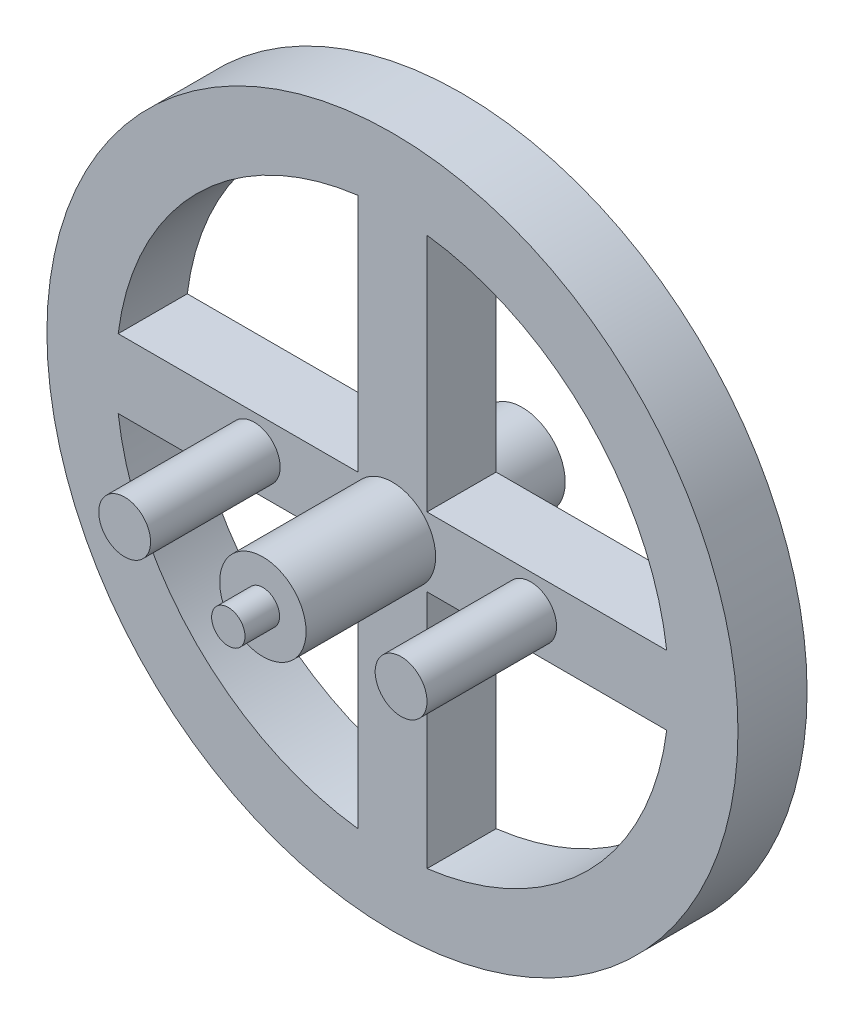
ISO-10303-21;
HEADER;
FILE_DESCRIPTION(('STEP AP214'),'2;1');
FILE_NAME('part.step','',(''),(''),'','','');
FILE_SCHEMA(('AUTOMOTIVE_DESIGN { 1 0 10303 214 1 1 1 1 }'));
ENDSEC;
DATA;
#1=APPLICATION_CONTEXT('core data for automotive mechanical design processes');
#2=APPLICATION_PROTOCOL_DEFINITION('international standard','automotive_design',2000,#1);
#3=PRODUCT_CONTEXT('',#1,'mechanical');
#4=PRODUCT('Part','Part','',(#3));
#5=PRODUCT_RELATED_PRODUCT_CATEGORY('part','',(#4));
#6=PRODUCT_DEFINITION_FORMATION('','',#4);
#7=PRODUCT_DEFINITION_CONTEXT('part definition',#1,'design');
#8=PRODUCT_DEFINITION('design','',#6,#7);
#9=PRODUCT_DEFINITION_SHAPE('','',#8);
#10=(LENGTH_UNIT() NAMED_UNIT(*) SI_UNIT(.MILLI.,.METRE.));
#11=(NAMED_UNIT(*) PLANE_ANGLE_UNIT() SI_UNIT($,.RADIAN.));
#12=(NAMED_UNIT(*) SI_UNIT($,.STERADIAN.) SOLID_ANGLE_UNIT());
#13=UNCERTAINTY_MEASURE_WITH_UNIT(LENGTH_MEASURE(1.E-05),#10,'distance_accuracy_value','');
#14=(GEOMETRIC_REPRESENTATION_CONTEXT(3) GLOBAL_UNCERTAINTY_ASSIGNED_CONTEXT((#13)) GLOBAL_UNIT_ASSIGNED_CONTEXT((#10,
#11,#12)) REPRESENTATION_CONTEXT('',''));
#15=CARTESIAN_POINT('',(0.,0.,0.));
#16=DIRECTION('',(0.,0.,1.));
#17=DIRECTION('',(1.,0.,0.));
#18=AXIS2_PLACEMENT_3D('',#15,#16,#17);
#19=CARTESIAN_POINT('',(0.,0.,4.));
#20=DIRECTION('',(0.,0.,1.));
#21=DIRECTION('',(1.,0.,0.));
#22=AXIS2_PLACEMENT_3D('',#19,#20,#21);
#23=PLANE('',#22);
#24=CARTESIAN_POINT('',(8.,0.,4.));
#25=DIRECTION('',(0.,0.,1.));
#26=DIRECTION('',(1.,0.,0.));
#27=AXIS2_PLACEMENT_3D('',#24,#25,#26);
#28=CIRCLE('',#27,1.5);
#29=CARTESIAN_POINT('',(9.5,0.,4.));
#30=VERTEX_POINT('',#29);
#31=EDGE_CURVE('E343',#30,#30,#28,.T.);
#32=ORIENTED_EDGE('',*,*,#31,.F.);
#33=EDGE_LOOP('',(#32));
#34=FACE_BOUND('',#33,.T.);
#35=DIRECTION('',(1.,0.,0.));
#36=VECTOR('',#35,1.);
#37=CARTESIAN_POINT('',(-15.8745078663875,2.,4.));
#38=LINE('',#37,#36);
#39=CARTESIAN_POINT('',(-15.8745078663875,2.,4.));
#40=VERTEX_POINT('',#39);
#41=CARTESIAN_POINT('',(-2.,2.,4.));
#42=VERTEX_POINT('',#41);
#43=EDGE_CURVE('E133',#40,#42,#38,.T.);
#44=ORIENTED_EDGE('',*,*,#43,.F.);
#45=CARTESIAN_POINT('',(0.,0.,4.));
#46=DIRECTION('',(0.,0.,1.));
#47=DIRECTION('',(1.,0.,0.));
#48=AXIS2_PLACEMENT_3D('',#45,#46,#47);
#49=CIRCLE('',#48,16.);
#50=CARTESIAN_POINT('',(-2.,15.8745078663875,4.));
#51=VERTEX_POINT('',#50);
#52=EDGE_CURVE('E125',#51,#40,#49,.T.);
#53=ORIENTED_EDGE('',*,*,#52,.F.);
#54=DIRECTION('',(0.,1.,0.));
#55=VECTOR('',#54,1.);
#56=CARTESIAN_POINT('',(-2.,15.8745078663875,4.));
#57=LINE('',#56,#55);
#58=EDGE_CURVE('E143',#42,#51,#57,.T.);
#59=ORIENTED_EDGE('',*,*,#58,.F.);
#60=EDGE_LOOP('',(#44,#53,#59));
#61=FACE_BOUND('',#60,.T.);
#62=CARTESIAN_POINT('',(0.,0.,4.));
#63=DIRECTION('',(0.,0.,1.));
#64=DIRECTION('',(1.,0.,0.));
#65=AXIS2_PLACEMENT_3D('',#62,#63,#64);
#66=CIRCLE('',#65,16.);
#67=CARTESIAN_POINT('',(15.8745078663875,2.,4.));
#68=VERTEX_POINT('',#67);
#69=CARTESIAN_POINT('',(2.,15.8745078663875,4.));
#70=VERTEX_POINT('',#69);
#71=EDGE_CURVE('E181',#68,#70,#66,.T.);
#72=ORIENTED_EDGE('',*,*,#71,.F.);
#73=DIRECTION('',(1.,0.,0.));
#74=VECTOR('',#73,1.);
#75=CARTESIAN_POINT('',(2.,2.,4.));
#76=LINE('',#75,#74);
#77=CARTESIAN_POINT('',(2.,2.,4.));
#78=VERTEX_POINT('',#77);
#79=EDGE_CURVE('E179',#78,#68,#76,.T.);
#80=ORIENTED_EDGE('',*,*,#79,.F.);
#81=DIRECTION('',(0.,-1.,0.));
#82=VECTOR('',#81,1.);
#83=CARTESIAN_POINT('',(2.,15.8745078663875,4.));
#84=LINE('',#83,#82);
#85=EDGE_CURVE('E185',#70,#78,#84,.T.);
#86=ORIENTED_EDGE('',*,*,#85,.F.);
#87=EDGE_LOOP('',(#72,#80,#86));
#88=FACE_BOUND('',#87,.T.);
#89=CARTESIAN_POINT('',(0.,0.,4.));
#90=DIRECTION('',(0.,0.,1.));
#91=DIRECTION('',(1.,0.,0.));
#92=AXIS2_PLACEMENT_3D('',#89,#90,#91);
#93=CIRCLE('',#92,20.);
#94=CARTESIAN_POINT('',(20.,0.,4.));
#95=VERTEX_POINT('',#94);
#96=EDGE_CURVE('E44',#95,#95,#93,.T.);
#97=ORIENTED_EDGE('',*,*,#96,.T.);
#98=EDGE_LOOP('',(#97));
#99=FACE_BOUND('',#98,.T.);
#100=DIRECTION('',(0.,1.,0.));
#101=VECTOR('',#100,1.);
#102=CARTESIAN_POINT('',(-2.,-2.,4.));
#103=LINE('',#102,#101);
#104=CARTESIAN_POINT('',(-2.,-15.8745078663875,4.));
#105=VERTEX_POINT('',#104);
#106=CARTESIAN_POINT('',(-2.,-2.,4.));
#107=VERTEX_POINT('',#106);
#108=EDGE_CURVE('E205',#105,#107,#103,.T.);
#109=ORIENTED_EDGE('',*,*,#108,.F.);
#110=CARTESIAN_POINT('',(0.,0.,4.));
#111=DIRECTION('',(0.,0.,1.));
#112=DIRECTION('',(1.,0.,0.));
#113=AXIS2_PLACEMENT_3D('',#110,#111,#112);
#114=CIRCLE('',#113,16.);
#115=CARTESIAN_POINT('',(-15.8745078663875,-2.,4.));
#116=VERTEX_POINT('',#115);
#117=EDGE_CURVE('E203',#116,#105,#114,.T.);
#118=ORIENTED_EDGE('',*,*,#117,.F.);
#119=DIRECTION('',(-1.,0.,0.));
#120=VECTOR('',#119,1.);
#121=CARTESIAN_POINT('',(-15.8745078663875,-2.,4.));
#122=LINE('',#121,#120);
#123=EDGE_CURVE('E209',#107,#116,#122,.T.);
#124=ORIENTED_EDGE('',*,*,#123,.F.);
#125=EDGE_LOOP('',(#109,#118,#124));
#126=FACE_BOUND('',#125,.T.);
#127=DIRECTION('',(-1.,0.,0.));
#128=VECTOR('',#127,1.);
#129=CARTESIAN_POINT('',(2.,-2.,4.));
#130=LINE('',#129,#128);
#131=CARTESIAN_POINT('',(15.8745078663875,-2.,4.));
#132=VERTEX_POINT('',#131);
#133=CARTESIAN_POINT('',(2.,-2.,4.));
#134=VERTEX_POINT('',#133);
#135=EDGE_CURVE('E157',#132,#134,#130,.T.);
#136=ORIENTED_EDGE('',*,*,#135,.F.);
#137=CARTESIAN_POINT('',(0.,0.,4.));
#138=DIRECTION('',(0.,0.,1.));
#139=DIRECTION('',(1.,0.,0.));
#140=AXIS2_PLACEMENT_3D('',#137,#138,#139);
#141=CIRCLE('',#140,16.);
#142=CARTESIAN_POINT('',(2.,-15.8745078663875,4.));
#143=VERTEX_POINT('',#142);
#144=EDGE_CURVE('E155',#143,#132,#141,.T.);
#145=ORIENTED_EDGE('',*,*,#144,.F.);
#146=DIRECTION('',(0.,-1.,0.));
#147=VECTOR('',#146,1.);
#148=CARTESIAN_POINT('',(2.,-2.,4.));
#149=LINE('',#148,#147);
#150=EDGE_CURVE('E161',#134,#143,#149,.T.);
#151=ORIENTED_EDGE('',*,*,#150,.F.);
#152=EDGE_LOOP('',(#136,#145,#151));
#153=FACE_BOUND('',#152,.T.);
#154=CARTESIAN_POINT('',(0.,0.,4.));
#155=DIRECTION('',(0.,0.,1.));
#156=DIRECTION('',(1.,0.,0.));
#157=AXIS2_PLACEMENT_3D('',#154,#155,#156);
#158=CIRCLE('',#157,2.5);
#159=CARTESIAN_POINT('',(2.5,0.,4.));
#160=VERTEX_POINT('',#159);
#161=EDGE_CURVE('E149',#160,#160,#158,.F.);
#162=ORIENTED_EDGE('',*,*,#161,.T.);
#163=EDGE_LOOP('',(#162));
#164=FACE_BOUND('',#163,.T.);
#165=CARTESIAN_POINT('',(-8.,0.,4.));
#166=DIRECTION('',(0.,0.,1.));
#167=DIRECTION('',(1.,0.,0.));
#168=AXIS2_PLACEMENT_3D('',#165,#166,#167);
#169=CIRCLE('',#168,1.5);
#170=CARTESIAN_POINT('',(-6.5,0.,4.));
#171=VERTEX_POINT('',#170);
#172=EDGE_CURVE('E338',#171,#171,#169,.T.);
#173=ORIENTED_EDGE('',*,*,#172,.F.);
#174=EDGE_LOOP('',(#173));
#175=FACE_BOUND('',#174,.T.);
#176=ADVANCED_FACE('F36',(#34,#61,#88,#99,#126,#153,#164,#175),#23,.T.);
#177=CARTESIAN_POINT('',(0.,0.,11.5));
#178=DIRECTION('',(0.,0.,1.));
#179=DIRECTION('',(1.,0.,0.));
#180=AXIS2_PLACEMENT_3D('',#177,#178,#179);
#181=PLANE('',#180);
#182=CARTESIAN_POINT('',(0.,0.,11.5));
#183=DIRECTION('',(0.,0.,1.));
#184=DIRECTION('',(1.,0.,0.));
#185=AXIS2_PLACEMENT_3D('',#182,#183,#184);
#186=CIRCLE('',#185,2.5);
#187=CARTESIAN_POINT('',(2.5,0.,11.5));
#188=VERTEX_POINT('',#187);
#189=EDGE_CURVE('E358',#188,#188,#186,.T.);
#190=ORIENTED_EDGE('',*,*,#189,.T.);
#191=EDGE_LOOP('',(#190));
#192=FACE_BOUND('',#191,.T.);
#193=CARTESIAN_POINT('',(0.,0.,11.5));
#194=DIRECTION('',(0.,0.,1.));
#195=DIRECTION('',(1.,0.,0.));
#196=AXIS2_PLACEMENT_3D('',#193,#194,#195);
#197=CIRCLE('',#196,0.966516747282674);
#198=CARTESIAN_POINT('',(0.966516747282674,0.,11.5));
#199=VERTEX_POINT('',#198);
#200=EDGE_CURVE('E349',#199,#199,#197,.T.);
#201=ORIENTED_EDGE('',*,*,#200,.F.);
#202=EDGE_LOOP('',(#201));
#203=FACE_BOUND('',#202,.T.);
#204=ADVANCED_FACE('F240',(#192,#203),#181,.T.);
#205=CARTESIAN_POINT('',(0.,0.,0.));
#206=DIRECTION('',(0.,0.,1.));
#207=DIRECTION('',(1.,0.,0.));
#208=AXIS2_PLACEMENT_3D('',#205,#206,#207);
#209=PLANE('',#208);
#210=CARTESIAN_POINT('',(0.,0.,0.));
#211=DIRECTION('',(0.,0.,1.));
#212=DIRECTION('',(1.,0.,0.));
#213=AXIS2_PLACEMENT_3D('',#210,#211,#212);
#214=CIRCLE('',#213,16.);
#215=CARTESIAN_POINT('',(-2.,15.8745078663875,0.));
#216=VERTEX_POINT('',#215);
#217=CARTESIAN_POINT('',(-15.8745078663875,2.,0.));
#218=VERTEX_POINT('',#217);
#219=EDGE_CURVE('E59',#216,#218,#214,.T.);
#220=ORIENTED_EDGE('',*,*,#219,.T.);
#221=DIRECTION('',(1.,0.,0.));
#222=VECTOR('',#221,1.);
#223=CARTESIAN_POINT('',(-15.8745078663875,2.,0.));
#224=LINE('',#223,#222);
#225=CARTESIAN_POINT('',(-2.,2.,0.));
#226=VERTEX_POINT('',#225);
#227=EDGE_CURVE('E139',#218,#226,#224,.T.);
#228=ORIENTED_EDGE('',*,*,#227,.T.);
#229=DIRECTION('',(0.,1.,0.));
#230=VECTOR('',#229,1.);
#231=CARTESIAN_POINT('',(-2.,15.8745078663875,0.));
#232=LINE('',#231,#230);
#233=EDGE_CURVE('E134',#226,#216,#232,.T.);
#234=ORIENTED_EDGE('',*,*,#233,.T.);
#235=EDGE_LOOP('',(#220,#228,#234));
#236=FACE_BOUND('',#235,.T.);
#237=DIRECTION('',(1.,0.,0.));
#238=VECTOR('',#237,1.);
#239=CARTESIAN_POINT('',(2.,2.,0.));
#240=LINE('',#239,#238);
#241=CARTESIAN_POINT('',(2.,2.,0.));
#242=VERTEX_POINT('',#241);
#243=CARTESIAN_POINT('',(15.8745078663875,2.,0.));
#244=VERTEX_POINT('',#243);
#245=EDGE_CURVE('E178',#242,#244,#240,.T.);
#246=ORIENTED_EDGE('',*,*,#245,.T.);
#247=CARTESIAN_POINT('',(0.,0.,0.));
#248=DIRECTION('',(0.,0.,1.));
#249=DIRECTION('',(1.,0.,0.));
#250=AXIS2_PLACEMENT_3D('',#247,#248,#249);
#251=CIRCLE('',#250,16.);
#252=CARTESIAN_POINT('',(2.,15.8745078663875,0.));
#253=VERTEX_POINT('',#252);
#254=EDGE_CURVE('E190',#244,#253,#251,.T.);
#255=ORIENTED_EDGE('',*,*,#254,.T.);
#256=DIRECTION('',(0.,-1.,0.));
#257=VECTOR('',#256,1.);
#258=CARTESIAN_POINT('',(2.,15.8745078663875,0.));
#259=LINE('',#258,#257);
#260=EDGE_CURVE('E182',#253,#242,#259,.T.);
#261=ORIENTED_EDGE('',*,*,#260,.T.);
#262=EDGE_LOOP('',(#246,#255,#261));
#263=FACE_BOUND('',#262,.T.);
#264=CARTESIAN_POINT('',(0.,0.,0.));
#265=DIRECTION('',(0.,0.,1.));
#266=DIRECTION('',(1.,0.,0.));
#267=AXIS2_PLACEMENT_3D('',#264,#265,#266);
#268=CIRCLE('',#267,20.);
#269=CARTESIAN_POINT('',(20.,0.,0.));
#270=VERTEX_POINT('',#269);
#271=EDGE_CURVE('E226',#270,#270,#268,.T.);
#272=ORIENTED_EDGE('',*,*,#271,.F.);
#273=EDGE_LOOP('',(#272));
#274=FACE_BOUND('',#273,.T.);
#275=CARTESIAN_POINT('',(0.,0.,0.));
#276=DIRECTION('',(0.,0.,1.));
#277=DIRECTION('',(1.,0.,0.));
#278=AXIS2_PLACEMENT_3D('',#275,#276,#277);
#279=CIRCLE('',#278,16.);
#280=CARTESIAN_POINT('',(-15.8745078663875,-2.,0.));
#281=VERTEX_POINT('',#280);
#282=CARTESIAN_POINT('',(-2.,-15.8745078663875,0.));
#283=VERTEX_POINT('',#282);
#284=EDGE_CURVE('E202',#281,#283,#279,.T.);
#285=ORIENTED_EDGE('',*,*,#284,.T.);
#286=DIRECTION('',(0.,1.,0.));
#287=VECTOR('',#286,1.);
#288=CARTESIAN_POINT('',(-2.,-2.,0.));
#289=LINE('',#288,#287);
#290=CARTESIAN_POINT('',(-2.,-2.,0.));
#291=VERTEX_POINT('',#290);
#292=EDGE_CURVE('E214',#283,#291,#289,.T.);
#293=ORIENTED_EDGE('',*,*,#292,.T.);
#294=DIRECTION('',(-1.,0.,0.));
#295=VECTOR('',#294,1.);
#296=CARTESIAN_POINT('',(-15.8745078663875,-2.,0.));
#297=LINE('',#296,#295);
#298=EDGE_CURVE('E206',#291,#281,#297,.T.);
#299=ORIENTED_EDGE('',*,*,#298,.T.);
#300=EDGE_LOOP('',(#285,#293,#299));
#301=FACE_BOUND('',#300,.T.);
#302=CARTESIAN_POINT('',(0.,0.,0.));
#303=DIRECTION('',(0.,0.,1.));
#304=DIRECTION('',(1.,0.,0.));
#305=AXIS2_PLACEMENT_3D('',#302,#303,#304);
#306=CIRCLE('',#305,16.);
#307=CARTESIAN_POINT('',(2.,-15.8745078663875,0.));
#308=VERTEX_POINT('',#307);
#309=CARTESIAN_POINT('',(15.8745078663875,-2.,0.));
#310=VERTEX_POINT('',#309);
#311=EDGE_CURVE('E140',#308,#310,#306,.T.);
#312=ORIENTED_EDGE('',*,*,#311,.T.);
#313=DIRECTION('',(-1.,0.,0.));
#314=VECTOR('',#313,1.);
#315=CARTESIAN_POINT('',(2.,-2.,0.));
#316=LINE('',#315,#314);
#317=CARTESIAN_POINT('',(2.,-2.,0.));
#318=VERTEX_POINT('',#317);
#319=EDGE_CURVE('E166',#310,#318,#316,.T.);
#320=ORIENTED_EDGE('',*,*,#319,.T.);
#321=DIRECTION('',(0.,-1.,0.));
#322=VECTOR('',#321,1.);
#323=CARTESIAN_POINT('',(2.,-2.,0.));
#324=LINE('',#323,#322);
#325=EDGE_CURVE('E158',#318,#308,#324,.T.);
#326=ORIENTED_EDGE('',*,*,#325,.T.);
#327=EDGE_LOOP('',(#312,#320,#326));
#328=FACE_BOUND('',#327,.T.);
#329=CARTESIAN_POINT('',(0.,0.,0.));
#330=DIRECTION('',(0.,0.,1.));
#331=DIRECTION('',(1.,0.,0.));
#332=AXIS2_PLACEMENT_3D('',#329,#330,#331);
#333=CIRCLE('',#332,2.5);
#334=CARTESIAN_POINT('',(2.5,0.,0.));
#335=VERTEX_POINT('',#334);
#336=EDGE_CURVE('E11',#335,#335,#333,.F.);
#337=ORIENTED_EDGE('',*,*,#336,.F.);
#338=EDGE_LOOP('',(#337));
#339=FACE_BOUND('',#338,.T.);
#340=ADVANCED_FACE('F237',(#236,#263,#274,#301,#328,#339),#209,.F.);
#341=CARTESIAN_POINT('',(0.,0.,4.));
#342=DIRECTION('',(0.,0.,-1.));
#343=DIRECTION('',(-1.,0.,0.));
#344=AXIS2_PLACEMENT_3D('',#341,#342,#343);
#345=CYLINDRICAL_SURFACE('',#344,20.);
#346=ORIENTED_EDGE('',*,*,#96,.F.);
#347=EDGE_LOOP('',(#346));
#348=FACE_BOUND('',#347,.T.);
#349=ORIENTED_EDGE('',*,*,#271,.T.);
#350=EDGE_LOOP('',(#349));
#351=FACE_BOUND('',#350,.T.);
#352=ADVANCED_FACE('F38',(#348,#351),#345,.T.);
#353=CARTESIAN_POINT('',(0.,0.,4.));
#354=DIRECTION('',(0.,0.,-1.));
#355=DIRECTION('',(-1.,0.,0.));
#356=AXIS2_PLACEMENT_3D('',#353,#354,#355);
#357=CYLINDRICAL_SURFACE('',#356,16.);
#358=ORIENTED_EDGE('',*,*,#284,.F.);
#359=DIRECTION('',(0.,0.,-1.));
#360=VECTOR('',#359,1.);
#361=CARTESIAN_POINT('',(-15.8745078663875,-2.,4.));
#362=LINE('',#361,#360);
#363=EDGE_CURVE('E211',#116,#281,#362,.T.);
#364=ORIENTED_EDGE('',*,*,#363,.F.);
#365=ORIENTED_EDGE('',*,*,#117,.T.);
#366=DIRECTION('',(0.,0.,-1.));
#367=VECTOR('',#366,1.);
#368=CARTESIAN_POINT('',(-2.,-15.8745078663875,4.));
#369=LINE('',#368,#367);
#370=EDGE_CURVE('E223',#105,#283,#369,.T.);
#371=ORIENTED_EDGE('',*,*,#370,.T.);
#372=EDGE_LOOP('',(#358,#364,#365,#371));
#373=FACE_BOUND('',#372,.T.);
#374=ADVANCED_FACE('F273',(#373),#357,.F.);
#375=CARTESIAN_POINT('',(-2.,-2.,4.));
#376=DIRECTION('',(-1.,0.,0.));
#377=DIRECTION('',(0.,-1.,0.));
#378=AXIS2_PLACEMENT_3D('',#375,#376,#377);
#379=PLANE('',#378);
#380=ORIENTED_EDGE('',*,*,#292,.F.);
#381=ORIENTED_EDGE('',*,*,#370,.F.);
#382=ORIENTED_EDGE('',*,*,#108,.T.);
#383=DIRECTION('',(0.,0.,-1.));
#384=VECTOR('',#383,1.);
#385=CARTESIAN_POINT('',(-2.,-2.,4.));
#386=LINE('',#385,#384);
#387=EDGE_CURVE('E221',#107,#291,#386,.T.);
#388=ORIENTED_EDGE('',*,*,#387,.T.);
#389=EDGE_LOOP('',(#380,#381,#382,#388));
#390=FACE_BOUND('',#389,.T.);
#391=ADVANCED_FACE('F276',(#390),#379,.T.);
#392=CARTESIAN_POINT('',(-15.8745078663875,-2.,4.));
#393=DIRECTION('',(0.,-1.,0.));
#394=DIRECTION('',(0.,0.,-1.));
#395=AXIS2_PLACEMENT_3D('',#392,#393,#394);
#396=PLANE('',#395);
#397=ORIENTED_EDGE('',*,*,#298,.F.);
#398=ORIENTED_EDGE('',*,*,#387,.F.);
#399=ORIENTED_EDGE('',*,*,#123,.T.);
#400=ORIENTED_EDGE('',*,*,#363,.T.);
#401=EDGE_LOOP('',(#397,#398,#399,#400));
#402=FACE_BOUND('',#401,.T.);
#403=ADVANCED_FACE('F280',(#402),#396,.T.);
#404=CARTESIAN_POINT('',(2.,2.,4.));
#405=DIRECTION('',(0.,1.,0.));
#406=DIRECTION('',(0.,0.,1.));
#407=AXIS2_PLACEMENT_3D('',#404,#405,#406);
#408=PLANE('',#407);
#409=ORIENTED_EDGE('',*,*,#245,.F.);
#410=DIRECTION('',(0.,0.,-1.));
#411=VECTOR('',#410,1.);
#412=CARTESIAN_POINT('',(2.,2.,4.));
#413=LINE('',#412,#411);
#414=EDGE_CURVE('E187',#78,#242,#413,.T.);
#415=ORIENTED_EDGE('',*,*,#414,.F.);
#416=ORIENTED_EDGE('',*,*,#79,.T.);
#417=DIRECTION('',(0.,0.,-1.));
#418=VECTOR('',#417,1.);
#419=CARTESIAN_POINT('',(15.8745078663875,2.,4.));
#420=LINE('',#419,#418);
#421=EDGE_CURVE('E199',#68,#244,#420,.T.);
#422=ORIENTED_EDGE('',*,*,#421,.T.);
#423=EDGE_LOOP('',(#409,#415,#416,#422));
#424=FACE_BOUND('',#423,.T.);
#425=ADVANCED_FACE('F284',(#424),#408,.T.);
#426=CARTESIAN_POINT('',(0.,0.,4.));
#427=DIRECTION('',(0.,0.,-1.));
#428=DIRECTION('',(-1.,0.,0.));
#429=AXIS2_PLACEMENT_3D('',#426,#427,#428);
#430=CYLINDRICAL_SURFACE('',#429,16.);
#431=ORIENTED_EDGE('',*,*,#254,.F.);
#432=ORIENTED_EDGE('',*,*,#421,.F.);
#433=ORIENTED_EDGE('',*,*,#71,.T.);
#434=DIRECTION('',(0.,0.,-1.));
#435=VECTOR('',#434,1.);
#436=CARTESIAN_POINT('',(2.,15.8745078663875,4.));
#437=LINE('',#436,#435);
#438=EDGE_CURVE('E197',#70,#253,#437,.T.);
#439=ORIENTED_EDGE('',*,*,#438,.T.);
#440=EDGE_LOOP('',(#431,#432,#433,#439));
#441=FACE_BOUND('',#440,.T.);
#442=ADVANCED_FACE('F288',(#441),#430,.F.);
#443=CARTESIAN_POINT('',(2.,15.8745078663875,4.));
#444=DIRECTION('',(1.,0.,0.));
#445=DIRECTION('',(0.,1.,0.));
#446=AXIS2_PLACEMENT_3D('',#443,#444,#445);
#447=PLANE('',#446);
#448=ORIENTED_EDGE('',*,*,#260,.F.);
#449=ORIENTED_EDGE('',*,*,#438,.F.);
#450=ORIENTED_EDGE('',*,*,#85,.T.);
#451=ORIENTED_EDGE('',*,*,#414,.T.);
#452=EDGE_LOOP('',(#448,#449,#450,#451));
#453=FACE_BOUND('',#452,.T.);
#454=ADVANCED_FACE('F292',(#453),#447,.T.);
#455=CARTESIAN_POINT('',(0.,0.,4.));
#456=DIRECTION('',(0.,0.,-1.));
#457=DIRECTION('',(-1.,0.,0.));
#458=AXIS2_PLACEMENT_3D('',#455,#456,#457);
#459=CYLINDRICAL_SURFACE('',#458,16.);
#460=ORIENTED_EDGE('',*,*,#311,.F.);
#461=DIRECTION('',(0.,0.,-1.));
#462=VECTOR('',#461,1.);
#463=CARTESIAN_POINT('',(2.,-15.8745078663875,4.));
#464=LINE('',#463,#462);
#465=EDGE_CURVE('E163',#143,#308,#464,.T.);
#466=ORIENTED_EDGE('',*,*,#465,.F.);
#467=ORIENTED_EDGE('',*,*,#144,.T.);
#468=DIRECTION('',(0.,0.,-1.));
#469=VECTOR('',#468,1.);
#470=CARTESIAN_POINT('',(15.8745078663875,-2.,4.));
#471=LINE('',#470,#469);
#472=EDGE_CURVE('E175',#132,#310,#471,.T.);
#473=ORIENTED_EDGE('',*,*,#472,.T.);
#474=EDGE_LOOP('',(#460,#466,#467,#473));
#475=FACE_BOUND('',#474,.T.);
#476=ADVANCED_FACE('F296',(#475),#459,.F.);
#477=CARTESIAN_POINT('',(2.,-2.,4.));
#478=DIRECTION('',(0.,-1.,0.));
#479=DIRECTION('',(0.,0.,-1.));
#480=AXIS2_PLACEMENT_3D('',#477,#478,#479);
#481=PLANE('',#480);
#482=ORIENTED_EDGE('',*,*,#319,.F.);
#483=ORIENTED_EDGE('',*,*,#472,.F.);
#484=ORIENTED_EDGE('',*,*,#135,.T.);
#485=DIRECTION('',(0.,0.,-1.));
#486=VECTOR('',#485,1.);
#487=CARTESIAN_POINT('',(2.,-2.,4.));
#488=LINE('',#487,#486);
#489=EDGE_CURVE('E173',#134,#318,#488,.T.);
#490=ORIENTED_EDGE('',*,*,#489,.T.);
#491=EDGE_LOOP('',(#482,#483,#484,#490));
#492=FACE_BOUND('',#491,.T.);
#493=ADVANCED_FACE('F300',(#492),#481,.T.);
#494=CARTESIAN_POINT('',(2.,-2.,4.));
#495=DIRECTION('',(1.,0.,0.));
#496=DIRECTION('',(0.,1.,0.));
#497=AXIS2_PLACEMENT_3D('',#494,#495,#496);
#498=PLANE('',#497);
#499=ORIENTED_EDGE('',*,*,#325,.F.);
#500=ORIENTED_EDGE('',*,*,#489,.F.);
#501=ORIENTED_EDGE('',*,*,#150,.T.);
#502=ORIENTED_EDGE('',*,*,#465,.T.);
#503=EDGE_LOOP('',(#499,#500,#501,#502));
#504=FACE_BOUND('',#503,.T.);
#505=ADVANCED_FACE('F304',(#504),#498,.T.);
#506=CARTESIAN_POINT('',(0.,0.,4.));
#507=DIRECTION('',(0.,0.,-1.));
#508=DIRECTION('',(-1.,0.,0.));
#509=AXIS2_PLACEMENT_3D('',#506,#507,#508);
#510=CYLINDRICAL_SURFACE('',#509,16.);
#511=ORIENTED_EDGE('',*,*,#219,.F.);
#512=DIRECTION('',(0.,0.,-1.));
#513=VECTOR('',#512,1.);
#514=CARTESIAN_POINT('',(-2.,15.8745078663875,4.));
#515=LINE('',#514,#513);
#516=EDGE_CURVE('E129',#51,#216,#515,.T.);
#517=ORIENTED_EDGE('',*,*,#516,.F.);
#518=ORIENTED_EDGE('',*,*,#52,.T.);
#519=DIRECTION('',(0.,0.,-1.));
#520=VECTOR('',#519,1.);
#521=CARTESIAN_POINT('',(-15.8745078663875,2.,4.));
#522=LINE('',#521,#520);
#523=EDGE_CURVE('E128',#40,#218,#522,.T.);
#524=ORIENTED_EDGE('',*,*,#523,.T.);
#525=EDGE_LOOP('',(#511,#517,#518,#524));
#526=FACE_BOUND('',#525,.T.);
#527=ADVANCED_FACE('F127',(#526),#510,.F.);
#528=CARTESIAN_POINT('',(-15.8745078663875,2.,4.));
#529=DIRECTION('',(0.,1.,0.));
#530=DIRECTION('',(0.,0.,1.));
#531=AXIS2_PLACEMENT_3D('',#528,#529,#530);
#532=PLANE('',#531);
#533=ORIENTED_EDGE('',*,*,#227,.F.);
#534=ORIENTED_EDGE('',*,*,#523,.F.);
#535=ORIENTED_EDGE('',*,*,#43,.T.);
#536=DIRECTION('',(0.,0.,-1.));
#537=VECTOR('',#536,1.);
#538=CARTESIAN_POINT('',(-2.,2.,4.));
#539=LINE('',#538,#537);
#540=EDGE_CURVE('E51',#42,#226,#539,.T.);
#541=ORIENTED_EDGE('',*,*,#540,.T.);
#542=EDGE_LOOP('',(#533,#534,#535,#541));
#543=FACE_BOUND('',#542,.T.);
#544=ADVANCED_FACE('F137',(#543),#532,.T.);
#545=CARTESIAN_POINT('',(-2.,15.8745078663875,4.));
#546=DIRECTION('',(-1.,0.,0.));
#547=DIRECTION('',(0.,-1.,0.));
#548=AXIS2_PLACEMENT_3D('',#545,#546,#547);
#549=PLANE('',#548);
#550=ORIENTED_EDGE('',*,*,#233,.F.);
#551=ORIENTED_EDGE('',*,*,#540,.F.);
#552=ORIENTED_EDGE('',*,*,#58,.T.);
#553=ORIENTED_EDGE('',*,*,#516,.T.);
#554=EDGE_LOOP('',(#550,#551,#552,#553));
#555=FACE_BOUND('',#554,.T.);
#556=ADVANCED_FACE('F258',(#555),#549,.T.);
#557=CARTESIAN_POINT('',(0.,0.,-3.5));
#558=DIRECTION('',(0.,0.,1.));
#559=DIRECTION('',(1.,0.,0.));
#560=AXIS2_PLACEMENT_3D('',#557,#558,#559);
#561=PLANE('',#560);
#562=CARTESIAN_POINT('',(0.,0.,-3.5));
#563=DIRECTION('',(0.,0.,1.));
#564=DIRECTION('',(1.,0.,0.));
#565=AXIS2_PLACEMENT_3D('',#562,#563,#564);
#566=CIRCLE('',#565,2.5);
#567=CARTESIAN_POINT('',(2.5,0.,-3.5));
#568=VERTEX_POINT('',#567);
#569=EDGE_CURVE('E355',#568,#568,#566,.T.);
#570=ORIENTED_EDGE('',*,*,#569,.F.);
#571=EDGE_LOOP('',(#570));
#572=FACE_BOUND('',#571,.T.);
#573=ADVANCED_FACE('F249',(#572),#561,.F.);
#574=CARTESIAN_POINT('',(0.,0.,11.5));
#575=DIRECTION('',(0.,0.,-1.));
#576=DIRECTION('',(-1.,0.,0.));
#577=AXIS2_PLACEMENT_3D('',#574,#575,#576);
#578=CYLINDRICAL_SURFACE('',#577,2.5);
#579=ORIENTED_EDGE('',*,*,#569,.T.);
#580=EDGE_LOOP('',(#579));
#581=FACE_BOUND('',#580,.T.);
#582=ORIENTED_EDGE('',*,*,#336,.T.);
#583=EDGE_LOOP('',(#582));
#584=FACE_BOUND('',#583,.T.);
#585=ADVANCED_FACE('F246',(#581,#584),#578,.T.);
#586=ORIENTED_EDGE('',*,*,#161,.F.);
#587=EDGE_LOOP('',(#586));
#588=FACE_BOUND('',#587,.T.);
#589=ORIENTED_EDGE('',*,*,#189,.F.);
#590=EDGE_LOOP('',(#589));
#591=FACE_BOUND('',#590,.T.);
#592=ADVANCED_FACE('F248',(#588,#591),#578,.T.);
#593=CARTESIAN_POINT('',(0.,0.,13.5));
#594=DIRECTION('',(0.,0.,-1.));
#595=DIRECTION('',(-1.,0.,0.));
#596=AXIS2_PLACEMENT_3D('',#593,#594,#595);
#597=CYLINDRICAL_SURFACE('',#596,0.966516747282674);
#598=CARTESIAN_POINT('',(0.,0.,13.5));
#599=DIRECTION('',(0.,0.,1.));
#600=DIRECTION('',(1.,0.,0.));
#601=AXIS2_PLACEMENT_3D('',#598,#599,#600);
#602=CIRCLE('',#601,0.966516747282674);
#603=CARTESIAN_POINT('',(0.966516747282674,0.,13.5));
#604=VERTEX_POINT('',#603);
#605=EDGE_CURVE('E352',#604,#604,#602,.T.);
#606=ORIENTED_EDGE('',*,*,#605,.F.);
#607=EDGE_LOOP('',(#606));
#608=FACE_BOUND('',#607,.T.);
#609=ORIENTED_EDGE('',*,*,#200,.T.);
#610=EDGE_LOOP('',(#609));
#611=FACE_BOUND('',#610,.T.);
#612=ADVANCED_FACE('F256',(#608,#611),#597,.T.);
#613=CARTESIAN_POINT('',(0.,0.,13.5));
#614=DIRECTION('',(0.,0.,1.));
#615=DIRECTION('',(1.,0.,0.));
#616=AXIS2_PLACEMENT_3D('',#613,#614,#615);
#617=PLANE('',#616);
#618=ORIENTED_EDGE('',*,*,#605,.T.);
#619=EDGE_LOOP('',(#618));
#620=FACE_BOUND('',#619,.T.);
#621=ADVANCED_FACE('F368',(#620),#617,.T.);
#622=CARTESIAN_POINT('',(8.,0.,11.5));
#623=DIRECTION('',(0.,0.,-1.));
#624=DIRECTION('',(-1.,0.,0.));
#625=AXIS2_PLACEMENT_3D('',#622,#623,#624);
#626=CYLINDRICAL_SURFACE('',#625,1.5);
#627=CARTESIAN_POINT('',(8.,0.,11.5));
#628=DIRECTION('',(0.,0.,1.));
#629=DIRECTION('',(1.,0.,0.));
#630=AXIS2_PLACEMENT_3D('',#627,#628,#629);
#631=CIRCLE('',#630,1.5);
#632=CARTESIAN_POINT('',(9.5,0.,11.5));
#633=VERTEX_POINT('',#632);
#634=EDGE_CURVE('E346',#633,#633,#631,.T.);
#635=ORIENTED_EDGE('',*,*,#634,.F.);
#636=EDGE_LOOP('',(#635));
#637=FACE_BOUND('',#636,.T.);
#638=ORIENTED_EDGE('',*,*,#31,.T.);
#639=EDGE_LOOP('',(#638));
#640=FACE_BOUND('',#639,.T.);
#641=ADVANCED_FACE('F374',(#637,#640),#626,.T.);
#642=CARTESIAN_POINT('',(8.,0.,11.5));
#643=DIRECTION('',(0.,0.,1.));
#644=DIRECTION('',(1.,0.,0.));
#645=AXIS2_PLACEMENT_3D('',#642,#643,#644);
#646=PLANE('',#645);
#647=ORIENTED_EDGE('',*,*,#634,.T.);
#648=EDGE_LOOP('',(#647));
#649=FACE_BOUND('',#648,.T.);
#650=ADVANCED_FACE('F381',(#649),#646,.T.);
#651=CARTESIAN_POINT('',(-8.,0.,11.5));
#652=DIRECTION('',(0.,0.,-1.));
#653=DIRECTION('',(-1.,0.,0.));
#654=AXIS2_PLACEMENT_3D('',#651,#652,#653);
#655=CYLINDRICAL_SURFACE('',#654,1.5);
#656=CARTESIAN_POINT('',(-8.,0.,11.5));
#657=DIRECTION('',(0.,0.,1.));
#658=DIRECTION('',(1.,0.,0.));
#659=AXIS2_PLACEMENT_3D('',#656,#657,#658);
#660=CIRCLE('',#659,1.5);
#661=CARTESIAN_POINT('',(-6.5,0.,11.5));
#662=VERTEX_POINT('',#661);
#663=EDGE_CURVE('E340',#662,#662,#660,.T.);
#664=ORIENTED_EDGE('',*,*,#663,.F.);
#665=EDGE_LOOP('',(#664));
#666=FACE_BOUND('',#665,.T.);
#667=ORIENTED_EDGE('',*,*,#172,.T.);
#668=EDGE_LOOP('',(#667));
#669=FACE_BOUND('',#668,.T.);
#670=ADVANCED_FACE('F385',(#666,#669),#655,.T.);
#671=CARTESIAN_POINT('',(-8.,0.,11.5));
#672=DIRECTION('',(0.,0.,1.));
#673=DIRECTION('',(1.,0.,0.));
#674=AXIS2_PLACEMENT_3D('',#671,#672,#673);
#675=PLANE('',#674);
#676=ORIENTED_EDGE('',*,*,#663,.T.);
#677=EDGE_LOOP('',(#676));
#678=FACE_BOUND('',#677,.T.);
#679=ADVANCED_FACE('F389',(#678),#675,.T.);
#680=CLOSED_SHELL('',(#176,#204,#340,#352,#374,#391,#403,#425,#442,#454,#476,#493,#505,#527,
#544,#556,#573,#585,#592,#612,#621,#641,#650,#670,#679));
#681=MANIFOLD_SOLID_BREP('B2',#680);
#682=ADVANCED_BREP_SHAPE_REPRESENTATION('',(#18,#681),#14);
#683=SHAPE_DEFINITION_REPRESENTATION(#9,#682);
ENDSEC;
END-ISO-10303-21;
